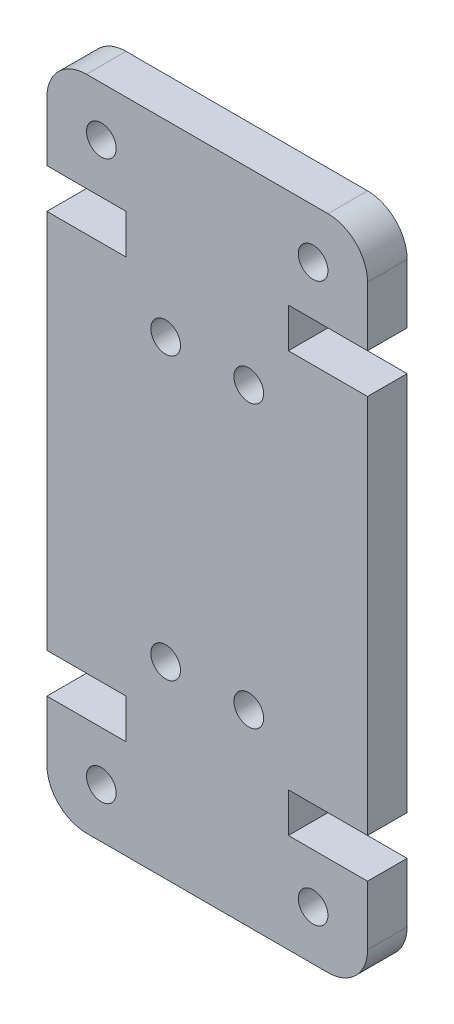
ISO-10303-21;
HEADER;
FILE_DESCRIPTION(('STEP AP214'),'2;1');
FILE_NAME('part.step','',(''),(''),'','','');
FILE_SCHEMA(('AUTOMOTIVE_DESIGN { 1 0 10303 214 1 1 1 1 }'));
ENDSEC;
DATA;
#1=APPLICATION_CONTEXT('core data for automotive mechanical design processes');
#2=APPLICATION_PROTOCOL_DEFINITION('international standard','automotive_design',2000,#1);
#3=PRODUCT_CONTEXT('',#1,'mechanical');
#4=PRODUCT('Part','Part','',(#3));
#5=PRODUCT_RELATED_PRODUCT_CATEGORY('part','',(#4));
#6=PRODUCT_DEFINITION_FORMATION('','',#4);
#7=PRODUCT_DEFINITION_CONTEXT('part definition',#1,'design');
#8=PRODUCT_DEFINITION('design','',#6,#7);
#9=PRODUCT_DEFINITION_SHAPE('','',#8);
#10=(LENGTH_UNIT() NAMED_UNIT(*) SI_UNIT(.MILLI.,.METRE.));
#11=(NAMED_UNIT(*) PLANE_ANGLE_UNIT() SI_UNIT($,.RADIAN.));
#12=(NAMED_UNIT(*) SI_UNIT($,.STERADIAN.) SOLID_ANGLE_UNIT());
#13=UNCERTAINTY_MEASURE_WITH_UNIT(LENGTH_MEASURE(1.E-05),#10,'distance_accuracy_value','');
#14=(GEOMETRIC_REPRESENTATION_CONTEXT(3) GLOBAL_UNCERTAINTY_ASSIGNED_CONTEXT((#13)) GLOBAL_UNIT_ASSIGNED_CONTEXT((#10,
#11,#12)) REPRESENTATION_CONTEXT('',''));
#15=CARTESIAN_POINT('',(0.,0.,0.));
#16=DIRECTION('',(0.,0.,1.));
#17=DIRECTION('',(1.,0.,0.));
#18=AXIS2_PLACEMENT_3D('',#15,#16,#17);
#19=CARTESIAN_POINT('',(2.00000000000001,2.,4.));
#20=DIRECTION('',(0.,0.,1.));
#21=DIRECTION('',(1.,0.,0.));
#22=AXIS2_PLACEMENT_3D('',#19,#20,#21);
#23=PLANE('',#22);
#24=CARTESIAN_POINT('',(10.2,23.7100000000004,4.));
#25=DIRECTION('',(0.,0.,1.));
#26=DIRECTION('',(1.,0.,0.));
#27=AXIS2_PLACEMENT_3D('',#24,#25,#26);
#28=CIRCLE('',#27,0.749999999999999);
#29=CARTESIAN_POINT('',(10.95,23.7100000000004,4.));
#30=VERTEX_POINT('',#29);
#31=EDGE_CURVE('E299',#30,#30,#28,.T.);
#32=ORIENTED_EDGE('',*,*,#31,.F.);
#33=EDGE_LOOP('',(#32));
#34=FACE_BOUND('',#33,.T.);
#35=CARTESIAN_POINT('',(6.,9.49999999999962,4.));
#36=DIRECTION('',(0.,0.,1.));
#37=DIRECTION('',(1.,0.,0.));
#38=AXIS2_PLACEMENT_3D('',#35,#36,#37);
#39=CIRCLE('',#38,0.75);
#40=CARTESIAN_POINT('',(6.75,9.49999999999962,4.));
#41=VERTEX_POINT('',#40);
#42=EDGE_CURVE('E305',#41,#41,#39,.T.);
#43=ORIENTED_EDGE('',*,*,#42,.F.);
#44=EDGE_LOOP('',(#43));
#45=FACE_BOUND('',#44,.T.);
#46=CARTESIAN_POINT('',(2.75000000000003,30.7099999999998,4.));
#47=DIRECTION('',(0.,0.,1.));
#48=DIRECTION('',(-1.,0.,0.));
#49=AXIS2_PLACEMENT_3D('',#46,#47,#48);
#50=CIRCLE('',#49,0.75);
#51=CARTESIAN_POINT('',(2.00000000000003,30.7099999999998,4.));
#52=VERTEX_POINT('',#51);
#53=EDGE_CURVE('E311',#52,#52,#50,.T.);
#54=ORIENTED_EDGE('',*,*,#53,.F.);
#55=EDGE_LOOP('',(#54));
#56=FACE_BOUND('',#55,.T.);
#57=CARTESIAN_POINT('',(13.45,2.50000000000017,4.));
#58=DIRECTION('',(0.,0.,1.));
#59=DIRECTION('',(-1.,0.,0.));
#60=AXIS2_PLACEMENT_3D('',#57,#58,#59);
#61=CIRCLE('',#60,0.750000000000009);
#62=CARTESIAN_POINT('',(12.7,2.50000000000017,4.));
#63=VERTEX_POINT('',#62);
#64=EDGE_CURVE('E317',#63,#63,#61,.T.);
#65=ORIENTED_EDGE('',*,*,#64,.F.);
#66=EDGE_LOOP('',(#65));
#67=FACE_BOUND('',#66,.T.);
#68=DIRECTION('',(1.,0.,0.));
#69=VECTOR('',#68,1.);
#70=CARTESIAN_POINT('',(0.,6.99999999999946,4.));
#71=LINE('',#70,#69);
#72=CARTESIAN_POINT('',(0.,6.99999999999946,4.));
#73=VERTEX_POINT('',#72);
#74=CARTESIAN_POINT('',(4.00000000000001,6.99999999999946,4.));
#75=VERTEX_POINT('',#74);
#76=EDGE_CURVE('E320',#73,#75,#71,.T.);
#77=ORIENTED_EDGE('',*,*,#76,.T.);
#78=DIRECTION('',(0.,-1.,0.));
#79=VECTOR('',#78,1.);
#80=CARTESIAN_POINT('',(4.00000000000001,6.99999999999946,4.));
#81=LINE('',#80,#79);
#82=CARTESIAN_POINT('',(4.,4.99999999999945,4.));
#83=VERTEX_POINT('',#82);
#84=EDGE_CURVE('E287',#75,#83,#81,.T.);
#85=ORIENTED_EDGE('',*,*,#84,.T.);
#86=DIRECTION('',(-1.,0.,0.));
#87=VECTOR('',#86,1.);
#88=CARTESIAN_POINT('',(4.,4.99999999999945,4.));
#89=LINE('',#88,#87);
#90=CARTESIAN_POINT('',(0.,4.99999999999945,4.));
#91=VERTEX_POINT('',#90);
#92=EDGE_CURVE('E283',#83,#91,#89,.T.);
#93=ORIENTED_EDGE('',*,*,#92,.T.);
#94=DIRECTION('',(0.,-1.,0.));
#95=VECTOR('',#94,1.);
#96=CARTESIAN_POINT('',(0.,2.,4.));
#97=LINE('',#96,#95);
#98=CARTESIAN_POINT('',(0.,2.,4.));
#99=VERTEX_POINT('',#98);
#100=EDGE_CURVE('E324',#91,#99,#97,.T.);
#101=ORIENTED_EDGE('',*,*,#100,.T.);
#102=CARTESIAN_POINT('',(2.00000000000001,2.,4.));
#103=DIRECTION('',(0.,0.,1.));
#104=DIRECTION('',(1.,0.,0.));
#105=AXIS2_PLACEMENT_3D('',#102,#103,#104);
#106=CIRCLE('',#105,2.00000000000001);
#107=CARTESIAN_POINT('',(2.00000000000001,0.,4.));
#108=VERTEX_POINT('',#107);
#109=EDGE_CURVE('E326',#99,#108,#106,.T.);
#110=ORIENTED_EDGE('',*,*,#109,.T.);
#111=DIRECTION('',(1.,0.,0.));
#112=VECTOR('',#111,1.);
#113=CARTESIAN_POINT('',(2.00000000000001,0.,4.));
#114=LINE('',#113,#112);
#115=CARTESIAN_POINT('',(14.2,0.,4.));
#116=VERTEX_POINT('',#115);
#117=EDGE_CURVE('E328',#108,#116,#114,.T.);
#118=ORIENTED_EDGE('',*,*,#117,.T.);
#119=CARTESIAN_POINT('',(14.2,2.,4.));
#120=DIRECTION('',(0.,0.,1.));
#121=DIRECTION('',(-1.,0.,0.));
#122=AXIS2_PLACEMENT_3D('',#119,#120,#121);
#123=CIRCLE('',#122,2.);
#124=CARTESIAN_POINT('',(16.2,2.,4.));
#125=VERTEX_POINT('',#124);
#126=EDGE_CURVE('E330',#116,#125,#123,.T.);
#127=ORIENTED_EDGE('',*,*,#126,.T.);
#128=DIRECTION('',(0.,1.,0.));
#129=VECTOR('',#128,1.);
#130=CARTESIAN_POINT('',(16.2,2.,4.));
#131=LINE('',#130,#129);
#132=CARTESIAN_POINT('',(16.2,4.99999999999945,4.));
#133=VERTEX_POINT('',#132);
#134=EDGE_CURVE('E332',#125,#133,#131,.T.);
#135=ORIENTED_EDGE('',*,*,#134,.T.);
#136=DIRECTION('',(-1.,0.,0.));
#137=VECTOR('',#136,1.);
#138=CARTESIAN_POINT('',(12.2,4.99999999999945,4.));
#139=LINE('',#138,#137);
#140=CARTESIAN_POINT('',(12.2,4.99999999999945,4.));
#141=VERTEX_POINT('',#140);
#142=EDGE_CURVE('E334',#133,#141,#139,.T.);
#143=ORIENTED_EDGE('',*,*,#142,.T.);
#144=DIRECTION('',(0.,1.,0.));
#145=VECTOR('',#144,1.);
#146=CARTESIAN_POINT('',(12.2,6.99999999999945,4.));
#147=LINE('',#146,#145);
#148=CARTESIAN_POINT('',(12.2,6.99999999999945,4.));
#149=VERTEX_POINT('',#148);
#150=EDGE_CURVE('E336',#141,#149,#147,.T.);
#151=ORIENTED_EDGE('',*,*,#150,.T.);
#152=DIRECTION('',(1.,0.,0.));
#153=VECTOR('',#152,1.);
#154=CARTESIAN_POINT('',(16.2,6.99999999999945,4.));
#155=LINE('',#154,#153);
#156=CARTESIAN_POINT('',(16.2,6.99999999999945,4.));
#157=VERTEX_POINT('',#156);
#158=EDGE_CURVE('E338',#149,#157,#155,.T.);
#159=ORIENTED_EDGE('',*,*,#158,.T.);
#160=DIRECTION('',(0.,1.,0.));
#161=VECTOR('',#160,1.);
#162=CARTESIAN_POINT('',(16.2,26.2100000000006,4.));
#163=LINE('',#162,#161);
#164=CARTESIAN_POINT('',(16.2,26.2100000000006,4.));
#165=VERTEX_POINT('',#164);
#166=EDGE_CURVE('E340',#157,#165,#163,.T.);
#167=ORIENTED_EDGE('',*,*,#166,.T.);
#168=DIRECTION('',(-1.,0.,0.));
#169=VECTOR('',#168,1.);
#170=CARTESIAN_POINT('',(16.2,26.2100000000006,4.));
#171=LINE('',#170,#169);
#172=CARTESIAN_POINT('',(12.2,26.2100000000006,4.));
#173=VERTEX_POINT('',#172);
#174=EDGE_CURVE('E342',#165,#173,#171,.T.);
#175=ORIENTED_EDGE('',*,*,#174,.T.);
#176=DIRECTION('',(0.,1.,0.));
#177=VECTOR('',#176,1.);
#178=CARTESIAN_POINT('',(12.2,26.2100000000006,4.));
#179=LINE('',#178,#177);
#180=CARTESIAN_POINT('',(12.2,28.2100000000006,4.));
#181=VERTEX_POINT('',#180);
#182=EDGE_CURVE('E344',#173,#181,#179,.T.);
#183=ORIENTED_EDGE('',*,*,#182,.T.);
#184=DIRECTION('',(1.,0.,0.));
#185=VECTOR('',#184,1.);
#186=CARTESIAN_POINT('',(12.2,28.2100000000006,4.));
#187=LINE('',#186,#185);
#188=CARTESIAN_POINT('',(16.2,28.2100000000006,4.));
#189=VERTEX_POINT('',#188);
#190=EDGE_CURVE('E346',#181,#189,#187,.T.);
#191=ORIENTED_EDGE('',*,*,#190,.T.);
#192=DIRECTION('',(0.,1.,0.));
#193=VECTOR('',#192,1.);
#194=CARTESIAN_POINT('',(16.2,31.21,4.));
#195=LINE('',#194,#193);
#196=CARTESIAN_POINT('',(16.2,31.21,4.));
#197=VERTEX_POINT('',#196);
#198=EDGE_CURVE('E348',#189,#197,#195,.T.);
#199=ORIENTED_EDGE('',*,*,#198,.T.);
#200=CARTESIAN_POINT('',(14.2,31.21,4.));
#201=DIRECTION('',(0.,0.,1.));
#202=DIRECTION('',(1.,0.,0.));
#203=AXIS2_PLACEMENT_3D('',#200,#201,#202);
#204=CIRCLE('',#203,2.);
#205=CARTESIAN_POINT('',(14.2,33.21,4.));
#206=VERTEX_POINT('',#205);
#207=EDGE_CURVE('E350',#197,#206,#204,.T.);
#208=ORIENTED_EDGE('',*,*,#207,.T.);
#209=DIRECTION('',(-1.,0.,0.));
#210=VECTOR('',#209,1.);
#211=CARTESIAN_POINT('',(1.99999999999999,33.21,4.));
#212=LINE('',#211,#210);
#213=CARTESIAN_POINT('',(1.99999999999999,33.21,4.));
#214=VERTEX_POINT('',#213);
#215=EDGE_CURVE('E352',#206,#214,#212,.T.);
#216=ORIENTED_EDGE('',*,*,#215,.T.);
#217=CARTESIAN_POINT('',(1.99999999999999,31.21,4.));
#218=DIRECTION('',(0.,0.,1.));
#219=DIRECTION('',(-1.,0.,0.));
#220=AXIS2_PLACEMENT_3D('',#217,#218,#219);
#221=CIRCLE('',#220,2.);
#222=CARTESIAN_POINT('',(0.,31.21,4.));
#223=VERTEX_POINT('',#222);
#224=EDGE_CURVE('E354',#214,#223,#221,.T.);
#225=ORIENTED_EDGE('',*,*,#224,.T.);
#226=DIRECTION('',(0.,-1.,0.));
#227=VECTOR('',#226,1.);
#228=CARTESIAN_POINT('',(0.,31.21,4.));
#229=LINE('',#228,#227);
#230=CARTESIAN_POINT('',(0.,28.2100000000006,4.));
#231=VERTEX_POINT('',#230);
#232=EDGE_CURVE('E222',#223,#231,#229,.T.);
#233=ORIENTED_EDGE('',*,*,#232,.T.);
#234=DIRECTION('',(1.,0.,0.));
#235=VECTOR('',#234,1.);
#236=CARTESIAN_POINT('',(3.99999999999999,28.2100000000006,4.));
#237=LINE('',#236,#235);
#238=CARTESIAN_POINT('',(3.99999999999999,28.2100000000006,4.));
#239=VERTEX_POINT('',#238);
#240=EDGE_CURVE('E357',#231,#239,#237,.T.);
#241=ORIENTED_EDGE('',*,*,#240,.T.);
#242=DIRECTION('',(0.,-1.,0.));
#243=VECTOR('',#242,1.);
#244=CARTESIAN_POINT('',(3.99999999999999,26.2100000000006,4.));
#245=LINE('',#244,#243);
#246=CARTESIAN_POINT('',(3.99999999999999,26.2100000000006,4.));
#247=VERTEX_POINT('',#246);
#248=EDGE_CURVE('E359',#239,#247,#245,.T.);
#249=ORIENTED_EDGE('',*,*,#248,.T.);
#250=DIRECTION('',(-1.,0.,0.));
#251=VECTOR('',#250,1.);
#252=CARTESIAN_POINT('',(0.,26.2100000000005,4.));
#253=LINE('',#252,#251);
#254=CARTESIAN_POINT('',(0.,26.2100000000005,4.));
#255=VERTEX_POINT('',#254);
#256=EDGE_CURVE('E361',#247,#255,#253,.T.);
#257=ORIENTED_EDGE('',*,*,#256,.T.);
#258=DIRECTION('',(0.,-1.,0.));
#259=VECTOR('',#258,1.);
#260=CARTESIAN_POINT('',(0.,26.2100000000005,4.));
#261=LINE('',#260,#259);
#262=EDGE_CURVE('E58',#255,#73,#261,.T.);
#263=ORIENTED_EDGE('',*,*,#262,.T.);
#264=EDGE_LOOP('',(#77,#85,#93,#101,#110,#118,#127,#135,#143,#151,#159,#167,#175,#183,#191,#199,
#208,#216,#225,#233,#241,#249,#257,#263));
#265=FACE_BOUND('',#264,.T.);
#266=CARTESIAN_POINT('',(10.2,9.49999999999962,4.));
#267=DIRECTION('',(0.,0.,1.));
#268=DIRECTION('',(-1.,0.,0.));
#269=AXIS2_PLACEMENT_3D('',#266,#267,#268);
#270=CIRCLE('',#269,0.750000000000002);
#271=CARTESIAN_POINT('',(9.45,9.49999999999962,4.));
#272=VERTEX_POINT('',#271);
#273=EDGE_CURVE('E314',#272,#272,#270,.T.);
#274=ORIENTED_EDGE('',*,*,#273,.F.);
#275=EDGE_LOOP('',(#274));
#276=FACE_BOUND('',#275,.T.);
#277=CARTESIAN_POINT('',(5.99999999999999,23.7100000000004,4.));
#278=DIRECTION('',(0.,0.,1.));
#279=DIRECTION('',(-1.,0.,0.));
#280=AXIS2_PLACEMENT_3D('',#277,#278,#279);
#281=CIRCLE('',#280,0.750000000000001);
#282=CARTESIAN_POINT('',(5.24999999999999,23.7100000000004,4.));
#283=VERTEX_POINT('',#282);
#284=EDGE_CURVE('E308',#283,#283,#281,.T.);
#285=ORIENTED_EDGE('',*,*,#284,.F.);
#286=EDGE_LOOP('',(#285));
#287=FACE_BOUND('',#286,.T.);
#288=CARTESIAN_POINT('',(2.75000000000004,2.50000000000017,4.));
#289=DIRECTION('',(0.,0.,1.));
#290=DIRECTION('',(1.,0.,0.));
#291=AXIS2_PLACEMENT_3D('',#288,#289,#290);
#292=CIRCLE('',#291,0.75);
#293=CARTESIAN_POINT('',(3.50000000000004,2.50000000000017,4.));
#294=VERTEX_POINT('',#293);
#295=EDGE_CURVE('E302',#294,#294,#292,.T.);
#296=ORIENTED_EDGE('',*,*,#295,.F.);
#297=EDGE_LOOP('',(#296));
#298=FACE_BOUND('',#297,.T.);
#299=CARTESIAN_POINT('',(13.45,30.7099999999998,4.));
#300=DIRECTION('',(0.,0.,1.));
#301=DIRECTION('',(1.,0.,0.));
#302=AXIS2_PLACEMENT_3D('',#299,#300,#301);
#303=CIRCLE('',#302,0.75000000000001);
#304=CARTESIAN_POINT('',(14.2,30.7099999999998,4.));
#305=VERTEX_POINT('',#304);
#306=EDGE_CURVE('E291',#305,#305,#303,.T.);
#307=ORIENTED_EDGE('',*,*,#306,.F.);
#308=EDGE_LOOP('',(#307));
#309=FACE_BOUND('',#308,.T.);
#310=ADVANCED_FACE('F34',(#34,#45,#56,#67,#265,#276,#287,#298,#309),#23,.T.);
#311=CARTESIAN_POINT('',(0.,6.99999999999946,4.));
#312=DIRECTION('',(0.,1.,0.));
#313=DIRECTION('',(0.,0.,1.));
#314=AXIS2_PLACEMENT_3D('',#311,#312,#313);
#315=PLANE('',#314);
#316=DIRECTION('',(0.,0.,-1.));
#317=VECTOR('',#316,1.);
#318=CARTESIAN_POINT('',(0.,6.99999999999946,4.));
#319=LINE('',#318,#317);
#320=CARTESIAN_POINT('',(0.,6.99999999999946,2.));
#321=VERTEX_POINT('',#320);
#322=EDGE_CURVE('E364',#73,#321,#319,.T.);
#323=ORIENTED_EDGE('',*,*,#322,.T.);
#324=DIRECTION('',(1.,0.,0.));
#325=VECTOR('',#324,1.);
#326=CARTESIAN_POINT('',(0.,6.99999999999946,2.));
#327=LINE('',#326,#325);
#328=CARTESIAN_POINT('',(4.00000000000001,6.99999999999946,2.));
#329=VERTEX_POINT('',#328);
#330=EDGE_CURVE('E50',#321,#329,#327,.T.);
#331=ORIENTED_EDGE('',*,*,#330,.T.);
#332=DIRECTION('',(0.,0.,-1.));
#333=VECTOR('',#332,1.);
#334=CARTESIAN_POINT('',(4.00000000000001,6.99999999999946,4.));
#335=LINE('',#334,#333);
#336=EDGE_CURVE('E11',#75,#329,#335,.T.);
#337=ORIENTED_EDGE('',*,*,#336,.F.);
#338=ORIENTED_EDGE('',*,*,#76,.F.);
#339=EDGE_LOOP('',(#323,#331,#337,#338));
#340=FACE_BOUND('',#339,.T.);
#341=ADVANCED_FACE('F36',(#340),#315,.F.);
#342=CARTESIAN_POINT('',(4.00000000000001,6.99999999999946,4.));
#343=DIRECTION('',(1.,0.,0.));
#344=DIRECTION('',(0.,1.,0.));
#345=AXIS2_PLACEMENT_3D('',#342,#343,#344);
#346=PLANE('',#345);
#347=ORIENTED_EDGE('',*,*,#336,.T.);
#348=DIRECTION('',(0.,-1.,0.));
#349=VECTOR('',#348,1.);
#350=CARTESIAN_POINT('',(4.00000000000001,6.99999999999946,2.));
#351=LINE('',#350,#349);
#352=CARTESIAN_POINT('',(4.,4.99999999999945,2.));
#353=VERTEX_POINT('',#352);
#354=EDGE_CURVE('E288',#329,#353,#351,.T.);
#355=ORIENTED_EDGE('',*,*,#354,.T.);
#356=DIRECTION('',(0.,0.,-1.));
#357=VECTOR('',#356,1.);
#358=CARTESIAN_POINT('',(4.,4.99999999999945,4.));
#359=LINE('',#358,#357);
#360=EDGE_CURVE('E43',#83,#353,#359,.T.);
#361=ORIENTED_EDGE('',*,*,#360,.F.);
#362=ORIENTED_EDGE('',*,*,#84,.F.);
#363=EDGE_LOOP('',(#347,#355,#361,#362));
#364=FACE_BOUND('',#363,.T.);
#365=ADVANCED_FACE('F286',(#364),#346,.F.);
#366=CARTESIAN_POINT('',(4.,4.99999999999945,4.));
#367=DIRECTION('',(0.,-1.,0.));
#368=DIRECTION('',(0.,0.,-1.));
#369=AXIS2_PLACEMENT_3D('',#366,#367,#368);
#370=PLANE('',#369);
#371=ORIENTED_EDGE('',*,*,#360,.T.);
#372=DIRECTION('',(-1.,0.,0.));
#373=VECTOR('',#372,1.);
#374=CARTESIAN_POINT('',(4.,4.99999999999945,2.));
#375=LINE('',#374,#373);
#376=CARTESIAN_POINT('',(0.,4.99999999999945,2.));
#377=VERTEX_POINT('',#376);
#378=EDGE_CURVE('E282',#353,#377,#375,.T.);
#379=ORIENTED_EDGE('',*,*,#378,.T.);
#380=DIRECTION('',(0.,0.,-1.));
#381=VECTOR('',#380,1.);
#382=CARTESIAN_POINT('',(0.,4.99999999999945,4.));
#383=LINE('',#382,#381);
#384=EDGE_CURVE('E272',#91,#377,#383,.T.);
#385=ORIENTED_EDGE('',*,*,#384,.F.);
#386=ORIENTED_EDGE('',*,*,#92,.F.);
#387=EDGE_LOOP('',(#371,#379,#385,#386));
#388=FACE_BOUND('',#387,.T.);
#389=ADVANCED_FACE('F280',(#388),#370,.F.);
#390=CARTESIAN_POINT('',(0.,2.,4.));
#391=DIRECTION('',(1.,0.,0.));
#392=DIRECTION('',(0.,0.,-1.));
#393=AXIS2_PLACEMENT_3D('',#390,#391,#392);
#394=PLANE('',#393);
#395=ORIENTED_EDGE('',*,*,#384,.T.);
#396=DIRECTION('',(0.,-1.,0.));
#397=VECTOR('',#396,1.);
#398=CARTESIAN_POINT('',(0.,33.21,2.));
#399=LINE('',#398,#397);
#400=CARTESIAN_POINT('',(0.,2.,2.));
#401=VERTEX_POINT('',#400);
#402=EDGE_CURVE('E209',#377,#401,#399,.T.);
#403=ORIENTED_EDGE('',*,*,#402,.T.);
#404=DIRECTION('',(0.,0.,-1.));
#405=VECTOR('',#404,1.);
#406=CARTESIAN_POINT('',(0.,2.,4.));
#407=LINE('',#406,#405);
#408=EDGE_CURVE('E269',#99,#401,#407,.T.);
#409=ORIENTED_EDGE('',*,*,#408,.F.);
#410=ORIENTED_EDGE('',*,*,#100,.F.);
#411=EDGE_LOOP('',(#395,#403,#409,#410));
#412=FACE_BOUND('',#411,.T.);
#413=ADVANCED_FACE('F427',(#412),#394,.F.);
#414=CARTESIAN_POINT('',(2.00000000000001,2.,4.));
#415=DIRECTION('',(0.,0.,-1.));
#416=DIRECTION('',(-1.,0.,0.));
#417=AXIS2_PLACEMENT_3D('',#414,#415,#416);
#418=CYLINDRICAL_SURFACE('',#417,2.00000000000001);
#419=ORIENTED_EDGE('',*,*,#408,.T.);
#420=CARTESIAN_POINT('',(2.00000000000001,2.,2.));
#421=DIRECTION('',(0.,0.,1.));
#422=DIRECTION('',(1.,0.,0.));
#423=AXIS2_PLACEMENT_3D('',#420,#421,#422);
#424=CIRCLE('',#423,2.00000000000001);
#425=CARTESIAN_POINT('',(2.00000000000001,0.,2.));
#426=VERTEX_POINT('',#425);
#427=EDGE_CURVE('E293',#401,#426,#424,.T.);
#428=ORIENTED_EDGE('',*,*,#427,.T.);
#429=DIRECTION('',(0.,0.,-1.));
#430=VECTOR('',#429,1.);
#431=CARTESIAN_POINT('',(2.00000000000001,0.,4.));
#432=LINE('',#431,#430);
#433=EDGE_CURVE('E266',#108,#426,#432,.T.);
#434=ORIENTED_EDGE('',*,*,#433,.F.);
#435=ORIENTED_EDGE('',*,*,#109,.F.);
#436=EDGE_LOOP('',(#419,#428,#434,#435));
#437=FACE_BOUND('',#436,.T.);
#438=ADVANCED_FACE('F413',(#437),#418,.T.);
#439=CARTESIAN_POINT('',(2.00000000000001,0.,4.));
#440=DIRECTION('',(0.,1.,0.));
#441=DIRECTION('',(-1.,0.,0.));
#442=AXIS2_PLACEMENT_3D('',#439,#440,#441);
#443=PLANE('',#442);
#444=ORIENTED_EDGE('',*,*,#433,.T.);
#445=DIRECTION('',(1.,0.,0.));
#446=VECTOR('',#445,1.);
#447=CARTESIAN_POINT('',(0.,0.,2.));
#448=LINE('',#447,#446);
#449=CARTESIAN_POINT('',(14.2,0.,2.));
#450=VERTEX_POINT('',#449);
#451=EDGE_CURVE('E206',#426,#450,#448,.T.);
#452=ORIENTED_EDGE('',*,*,#451,.T.);
#453=DIRECTION('',(0.,0.,-1.));
#454=VECTOR('',#453,1.);
#455=CARTESIAN_POINT('',(14.2,0.,4.));
#456=LINE('',#455,#454);
#457=EDGE_CURVE('E263',#116,#450,#456,.T.);
#458=ORIENTED_EDGE('',*,*,#457,.F.);
#459=ORIENTED_EDGE('',*,*,#117,.F.);
#460=EDGE_LOOP('',(#444,#452,#458,#459));
#461=FACE_BOUND('',#460,.T.);
#462=ADVANCED_FACE('F420',(#461),#443,.F.);
#463=CARTESIAN_POINT('',(14.2,2.,4.));
#464=DIRECTION('',(0.,0.,-1.));
#465=DIRECTION('',(-1.,0.,0.));
#466=AXIS2_PLACEMENT_3D('',#463,#464,#465);
#467=CYLINDRICAL_SURFACE('',#466,2.);
#468=ORIENTED_EDGE('',*,*,#457,.T.);
#469=CARTESIAN_POINT('',(14.2,2.,2.));
#470=DIRECTION('',(0.,0.,1.));
#471=DIRECTION('',(1.,0.,0.));
#472=AXIS2_PLACEMENT_3D('',#469,#470,#471);
#473=CIRCLE('',#472,2.);
#474=CARTESIAN_POINT('',(16.2,2.,2.));
#475=VERTEX_POINT('',#474);
#476=EDGE_CURVE('E408',#450,#475,#473,.T.);
#477=ORIENTED_EDGE('',*,*,#476,.T.);
#478=DIRECTION('',(0.,0.,-1.));
#479=VECTOR('',#478,1.);
#480=CARTESIAN_POINT('',(16.2,2.,4.));
#481=LINE('',#480,#479);
#482=EDGE_CURVE('E260',#125,#475,#481,.T.);
#483=ORIENTED_EDGE('',*,*,#482,.F.);
#484=ORIENTED_EDGE('',*,*,#126,.F.);
#485=EDGE_LOOP('',(#468,#477,#483,#484));
#486=FACE_BOUND('',#485,.T.);
#487=ADVANCED_FACE('F536',(#486),#467,.T.);
#488=CARTESIAN_POINT('',(16.2,2.,4.));
#489=DIRECTION('',(-1.,0.,0.));
#490=DIRECTION('',(0.,0.,1.));
#491=AXIS2_PLACEMENT_3D('',#488,#489,#490);
#492=PLANE('',#491);
#493=ORIENTED_EDGE('',*,*,#482,.T.);
#494=DIRECTION('',(0.,1.,0.));
#495=VECTOR('',#494,1.);
#496=CARTESIAN_POINT('',(16.2,0.,2.));
#497=LINE('',#496,#495);
#498=CARTESIAN_POINT('',(16.2,4.99999999999945,2.));
#499=VERTEX_POINT('',#498);
#500=EDGE_CURVE('E434',#475,#499,#497,.T.);
#501=ORIENTED_EDGE('',*,*,#500,.T.);
#502=DIRECTION('',(0.,0.,-1.));
#503=VECTOR('',#502,1.);
#504=CARTESIAN_POINT('',(16.2,4.99999999999945,4.));
#505=LINE('',#504,#503);
#506=EDGE_CURVE('E257',#133,#499,#505,.T.);
#507=ORIENTED_EDGE('',*,*,#506,.F.);
#508=ORIENTED_EDGE('',*,*,#134,.F.);
#509=EDGE_LOOP('',(#493,#501,#507,#508));
#510=FACE_BOUND('',#509,.T.);
#511=ADVANCED_FACE('F532',(#510),#492,.F.);
#512=CARTESIAN_POINT('',(12.2,4.99999999999945,4.));
#513=DIRECTION('',(0.,-1.,0.));
#514=DIRECTION('',(0.,0.,-1.));
#515=AXIS2_PLACEMENT_3D('',#512,#513,#514);
#516=PLANE('',#515);
#517=ORIENTED_EDGE('',*,*,#506,.T.);
#518=DIRECTION('',(-1.,0.,0.));
#519=VECTOR('',#518,1.);
#520=CARTESIAN_POINT('',(12.2,4.99999999999945,2.));
#521=LINE('',#520,#519);
#522=CARTESIAN_POINT('',(12.2,4.99999999999945,2.));
#523=VERTEX_POINT('',#522);
#524=EDGE_CURVE('E405',#499,#523,#521,.T.);
#525=ORIENTED_EDGE('',*,*,#524,.T.);
#526=DIRECTION('',(0.,0.,-1.));
#527=VECTOR('',#526,1.);
#528=CARTESIAN_POINT('',(12.2,4.99999999999945,4.));
#529=LINE('',#528,#527);
#530=EDGE_CURVE('E254',#141,#523,#529,.T.);
#531=ORIENTED_EDGE('',*,*,#530,.F.);
#532=ORIENTED_EDGE('',*,*,#142,.F.);
#533=EDGE_LOOP('',(#517,#525,#531,#532));
#534=FACE_BOUND('',#533,.T.);
#535=ADVANCED_FACE('F528',(#534),#516,.F.);
#536=CARTESIAN_POINT('',(12.2,6.99999999999945,4.));
#537=DIRECTION('',(-1.,0.,0.));
#538=DIRECTION('',(0.,0.,1.));
#539=AXIS2_PLACEMENT_3D('',#536,#537,#538);
#540=PLANE('',#539);
#541=ORIENTED_EDGE('',*,*,#530,.T.);
#542=DIRECTION('',(0.,1.,0.));
#543=VECTOR('',#542,1.);
#544=CARTESIAN_POINT('',(12.2,6.99999999999945,2.));
#545=LINE('',#544,#543);
#546=CARTESIAN_POINT('',(12.2,6.99999999999945,2.));
#547=VERTEX_POINT('',#546);
#548=EDGE_CURVE('E402',#523,#547,#545,.T.);
#549=ORIENTED_EDGE('',*,*,#548,.T.);
#550=DIRECTION('',(0.,0.,-1.));
#551=VECTOR('',#550,1.);
#552=CARTESIAN_POINT('',(12.2,6.99999999999945,4.));
#553=LINE('',#552,#551);
#554=EDGE_CURVE('E251',#149,#547,#553,.T.);
#555=ORIENTED_EDGE('',*,*,#554,.F.);
#556=ORIENTED_EDGE('',*,*,#150,.F.);
#557=EDGE_LOOP('',(#541,#549,#555,#556));
#558=FACE_BOUND('',#557,.T.);
#559=ADVANCED_FACE('F524',(#558),#540,.F.);
#560=CARTESIAN_POINT('',(16.2,6.99999999999945,4.));
#561=DIRECTION('',(0.,1.,0.));
#562=DIRECTION('',(-1.,0.,0.));
#563=AXIS2_PLACEMENT_3D('',#560,#561,#562);
#564=PLANE('',#563);
#565=ORIENTED_EDGE('',*,*,#554,.T.);
#566=DIRECTION('',(1.,0.,0.));
#567=VECTOR('',#566,1.);
#568=CARTESIAN_POINT('',(16.2,6.99999999999945,2.));
#569=LINE('',#568,#567);
#570=CARTESIAN_POINT('',(16.2,6.99999999999945,2.));
#571=VERTEX_POINT('',#570);
#572=EDGE_CURVE('E399',#547,#571,#569,.T.);
#573=ORIENTED_EDGE('',*,*,#572,.T.);
#574=DIRECTION('',(0.,0.,-1.));
#575=VECTOR('',#574,1.);
#576=CARTESIAN_POINT('',(16.2,6.99999999999945,4.));
#577=LINE('',#576,#575);
#578=EDGE_CURVE('E248',#157,#571,#577,.T.);
#579=ORIENTED_EDGE('',*,*,#578,.F.);
#580=ORIENTED_EDGE('',*,*,#158,.F.);
#581=EDGE_LOOP('',(#565,#573,#579,#580));
#582=FACE_BOUND('',#581,.T.);
#583=ADVANCED_FACE('F520',(#582),#564,.F.);
#584=CARTESIAN_POINT('',(16.2,26.2100000000006,4.));
#585=DIRECTION('',(-1.,0.,0.));
#586=DIRECTION('',(0.,0.,1.));
#587=AXIS2_PLACEMENT_3D('',#584,#585,#586);
#588=PLANE('',#587);
#589=ORIENTED_EDGE('',*,*,#578,.T.);
#590=CARTESIAN_POINT('',(16.2,26.2100000000006,2.));
#591=VERTEX_POINT('',#590);
#592=EDGE_CURVE('E433',#571,#591,#497,.T.);
#593=ORIENTED_EDGE('',*,*,#592,.T.);
#594=DIRECTION('',(0.,0.,-1.));
#595=VECTOR('',#594,1.);
#596=CARTESIAN_POINT('',(16.2,26.2100000000006,4.));
#597=LINE('',#596,#595);
#598=EDGE_CURVE('E245',#165,#591,#597,.T.);
#599=ORIENTED_EDGE('',*,*,#598,.F.);
#600=ORIENTED_EDGE('',*,*,#166,.F.);
#601=EDGE_LOOP('',(#589,#593,#599,#600));
#602=FACE_BOUND('',#601,.T.);
#603=ADVANCED_FACE('F516',(#602),#588,.F.);
#604=CARTESIAN_POINT('',(16.2,26.2100000000006,4.));
#605=DIRECTION('',(0.,-1.,0.));
#606=DIRECTION('',(0.,0.,-1.));
#607=AXIS2_PLACEMENT_3D('',#604,#605,#606);
#608=PLANE('',#607);
#609=ORIENTED_EDGE('',*,*,#598,.T.);
#610=DIRECTION('',(-1.,0.,0.));
#611=VECTOR('',#610,1.);
#612=CARTESIAN_POINT('',(16.2,26.2100000000006,2.));
#613=LINE('',#612,#611);
#614=CARTESIAN_POINT('',(12.2,26.2100000000006,2.));
#615=VERTEX_POINT('',#614);
#616=EDGE_CURVE('E396',#591,#615,#613,.T.);
#617=ORIENTED_EDGE('',*,*,#616,.T.);
#618=DIRECTION('',(0.,0.,-1.));
#619=VECTOR('',#618,1.);
#620=CARTESIAN_POINT('',(12.2,26.2100000000006,4.));
#621=LINE('',#620,#619);
#622=EDGE_CURVE('E242',#173,#615,#621,.T.);
#623=ORIENTED_EDGE('',*,*,#622,.F.);
#624=ORIENTED_EDGE('',*,*,#174,.F.);
#625=EDGE_LOOP('',(#609,#617,#623,#624));
#626=FACE_BOUND('',#625,.T.);
#627=ADVANCED_FACE('F512',(#626),#608,.F.);
#628=CARTESIAN_POINT('',(12.2,26.2100000000006,4.));
#629=DIRECTION('',(-1.,0.,0.));
#630=DIRECTION('',(0.,0.,1.));
#631=AXIS2_PLACEMENT_3D('',#628,#629,#630);
#632=PLANE('',#631);
#633=ORIENTED_EDGE('',*,*,#622,.T.);
#634=DIRECTION('',(0.,1.,0.));
#635=VECTOR('',#634,1.);
#636=CARTESIAN_POINT('',(12.2,26.2100000000006,2.));
#637=LINE('',#636,#635);
#638=CARTESIAN_POINT('',(12.2,28.2100000000006,2.));
#639=VERTEX_POINT('',#638);
#640=EDGE_CURVE('E393',#615,#639,#637,.T.);
#641=ORIENTED_EDGE('',*,*,#640,.T.);
#642=DIRECTION('',(0.,0.,-1.));
#643=VECTOR('',#642,1.);
#644=CARTESIAN_POINT('',(12.2,28.2100000000006,4.));
#645=LINE('',#644,#643);
#646=EDGE_CURVE('E239',#181,#639,#645,.T.);
#647=ORIENTED_EDGE('',*,*,#646,.F.);
#648=ORIENTED_EDGE('',*,*,#182,.F.);
#649=EDGE_LOOP('',(#633,#641,#647,#648));
#650=FACE_BOUND('',#649,.T.);
#651=ADVANCED_FACE('F508',(#650),#632,.F.);
#652=CARTESIAN_POINT('',(12.2,28.2100000000006,4.));
#653=DIRECTION('',(0.,1.,0.));
#654=DIRECTION('',(0.,0.,1.));
#655=AXIS2_PLACEMENT_3D('',#652,#653,#654);
#656=PLANE('',#655);
#657=ORIENTED_EDGE('',*,*,#646,.T.);
#658=DIRECTION('',(1.,0.,0.));
#659=VECTOR('',#658,1.);
#660=CARTESIAN_POINT('',(12.2,28.2100000000006,2.));
#661=LINE('',#660,#659);
#662=CARTESIAN_POINT('',(16.2,28.2100000000006,2.));
#663=VERTEX_POINT('',#662);
#664=EDGE_CURVE('E390',#639,#663,#661,.T.);
#665=ORIENTED_EDGE('',*,*,#664,.T.);
#666=DIRECTION('',(0.,0.,-1.));
#667=VECTOR('',#666,1.);
#668=CARTESIAN_POINT('',(16.2,28.2100000000006,4.));
#669=LINE('',#668,#667);
#670=EDGE_CURVE('E236',#189,#663,#669,.T.);
#671=ORIENTED_EDGE('',*,*,#670,.F.);
#672=ORIENTED_EDGE('',*,*,#190,.F.);
#673=EDGE_LOOP('',(#657,#665,#671,#672));
#674=FACE_BOUND('',#673,.T.);
#675=ADVANCED_FACE('F504',(#674),#656,.F.);
#676=CARTESIAN_POINT('',(16.2,31.21,4.));
#677=DIRECTION('',(-1.,0.,0.));
#678=DIRECTION('',(0.,0.,1.));
#679=AXIS2_PLACEMENT_3D('',#676,#677,#678);
#680=PLANE('',#679);
#681=ORIENTED_EDGE('',*,*,#670,.T.);
#682=CARTESIAN_POINT('',(16.2,31.21,2.));
#683=VERTEX_POINT('',#682);
#684=EDGE_CURVE('E430',#663,#683,#497,.T.);
#685=ORIENTED_EDGE('',*,*,#684,.T.);
#686=DIRECTION('',(0.,0.,-1.));
#687=VECTOR('',#686,1.);
#688=CARTESIAN_POINT('',(16.2,31.21,4.));
#689=LINE('',#688,#687);
#690=EDGE_CURVE('E233',#197,#683,#689,.T.);
#691=ORIENTED_EDGE('',*,*,#690,.F.);
#692=ORIENTED_EDGE('',*,*,#198,.F.);
#693=EDGE_LOOP('',(#681,#685,#691,#692));
#694=FACE_BOUND('',#693,.T.);
#695=ADVANCED_FACE('F500',(#694),#680,.F.);
#696=CARTESIAN_POINT('',(14.2,31.21,4.));
#697=DIRECTION('',(0.,0.,-1.));
#698=DIRECTION('',(-1.,0.,0.));
#699=AXIS2_PLACEMENT_3D('',#696,#697,#698);
#700=CYLINDRICAL_SURFACE('',#699,2.);
#701=ORIENTED_EDGE('',*,*,#690,.T.);
#702=CARTESIAN_POINT('',(14.2,31.21,2.));
#703=DIRECTION('',(0.,0.,1.));
#704=DIRECTION('',(1.,0.,0.));
#705=AXIS2_PLACEMENT_3D('',#702,#703,#704);
#706=CIRCLE('',#705,2.);
#707=CARTESIAN_POINT('',(14.2,33.21,2.));
#708=VERTEX_POINT('',#707);
#709=EDGE_CURVE('E219',#683,#708,#706,.T.);
#710=ORIENTED_EDGE('',*,*,#709,.T.);
#711=DIRECTION('',(0.,0.,-1.));
#712=VECTOR('',#711,1.);
#713=CARTESIAN_POINT('',(14.2,33.21,4.));
#714=LINE('',#713,#712);
#715=EDGE_CURVE('E225',#206,#708,#714,.T.);
#716=ORIENTED_EDGE('',*,*,#715,.F.);
#717=ORIENTED_EDGE('',*,*,#207,.F.);
#718=EDGE_LOOP('',(#701,#710,#716,#717));
#719=FACE_BOUND('',#718,.T.);
#720=ADVANCED_FACE('F496',(#719),#700,.T.);
#721=CARTESIAN_POINT('',(1.99999999999999,33.21,4.));
#722=DIRECTION('',(0.,-1.,0.));
#723=DIRECTION('',(0.,0.,-1.));
#724=AXIS2_PLACEMENT_3D('',#721,#722,#723);
#725=PLANE('',#724);
#726=ORIENTED_EDGE('',*,*,#715,.T.);
#727=DIRECTION('',(-1.,0.,0.));
#728=VECTOR('',#727,1.);
#729=CARTESIAN_POINT('',(16.2,33.21,2.));
#730=LINE('',#729,#728);
#731=CARTESIAN_POINT('',(1.99999999999999,33.21,2.));
#732=VERTEX_POINT('',#731);
#733=EDGE_CURVE('E435',#708,#732,#730,.T.);
#734=ORIENTED_EDGE('',*,*,#733,.T.);
#735=DIRECTION('',(0.,0.,-1.));
#736=VECTOR('',#735,1.);
#737=CARTESIAN_POINT('',(1.99999999999999,33.21,4.));
#738=LINE('',#737,#736);
#739=EDGE_CURVE('E218',#214,#732,#738,.T.);
#740=ORIENTED_EDGE('',*,*,#739,.F.);
#741=ORIENTED_EDGE('',*,*,#215,.F.);
#742=EDGE_LOOP('',(#726,#734,#740,#741));
#743=FACE_BOUND('',#742,.T.);
#744=ADVANCED_FACE('F493',(#743),#725,.F.);
#745=CARTESIAN_POINT('',(1.99999999999999,31.21,4.));
#746=DIRECTION('',(0.,0.,-1.));
#747=DIRECTION('',(-1.,0.,0.));
#748=AXIS2_PLACEMENT_3D('',#745,#746,#747);
#749=CYLINDRICAL_SURFACE('',#748,2.);
#750=ORIENTED_EDGE('',*,*,#739,.T.);
#751=CARTESIAN_POINT('',(1.99999999999999,31.21,2.));
#752=DIRECTION('',(0.,0.,1.));
#753=DIRECTION('',(1.,0.,0.));
#754=AXIS2_PLACEMENT_3D('',#751,#752,#753);
#755=CIRCLE('',#754,2.);
#756=CARTESIAN_POINT('',(0.,31.21,2.));
#757=VERTEX_POINT('',#756);
#758=EDGE_CURVE('E198',#732,#757,#755,.T.);
#759=ORIENTED_EDGE('',*,*,#758,.T.);
#760=DIRECTION('',(0.,0.,-1.));
#761=VECTOR('',#760,1.);
#762=CARTESIAN_POINT('',(0.,31.21,4.));
#763=LINE('',#762,#761);
#764=EDGE_CURVE('E215',#223,#757,#763,.T.);
#765=ORIENTED_EDGE('',*,*,#764,.F.);
#766=ORIENTED_EDGE('',*,*,#224,.F.);
#767=EDGE_LOOP('',(#750,#759,#765,#766));
#768=FACE_BOUND('',#767,.T.);
#769=ADVANCED_FACE('F213',(#768),#749,.T.);
#770=CARTESIAN_POINT('',(0.,31.21,4.));
#771=DIRECTION('',(1.,0.,0.));
#772=DIRECTION('',(0.,1.,0.));
#773=AXIS2_PLACEMENT_3D('',#770,#771,#772);
#774=PLANE('',#773);
#775=ORIENTED_EDGE('',*,*,#764,.T.);
#776=CARTESIAN_POINT('',(0.,28.2100000000006,2.));
#777=VERTEX_POINT('',#776);
#778=EDGE_CURVE('E195',#757,#777,#399,.T.);
#779=ORIENTED_EDGE('',*,*,#778,.T.);
#780=DIRECTION('',(0.,0.,-1.));
#781=VECTOR('',#780,1.);
#782=CARTESIAN_POINT('',(0.,28.2100000000006,4.));
#783=LINE('',#782,#781);
#784=EDGE_CURVE('E223',#231,#777,#783,.T.);
#785=ORIENTED_EDGE('',*,*,#784,.F.);
#786=ORIENTED_EDGE('',*,*,#232,.F.);
#787=EDGE_LOOP('',(#775,#779,#785,#786));
#788=FACE_BOUND('',#787,.T.);
#789=ADVANCED_FACE('F221',(#788),#774,.F.);
#790=CARTESIAN_POINT('',(3.99999999999999,28.2100000000006,4.));
#791=DIRECTION('',(0.,1.,0.));
#792=DIRECTION('',(-1.,0.,0.));
#793=AXIS2_PLACEMENT_3D('',#790,#791,#792);
#794=PLANE('',#793);
#795=ORIENTED_EDGE('',*,*,#784,.T.);
#796=DIRECTION('',(1.,0.,0.));
#797=VECTOR('',#796,1.);
#798=CARTESIAN_POINT('',(3.99999999999999,28.2100000000006,2.));
#799=LINE('',#798,#797);
#800=CARTESIAN_POINT('',(3.99999999999999,28.2100000000006,2.));
#801=VERTEX_POINT('',#800);
#802=EDGE_CURVE('E201',#777,#801,#799,.T.);
#803=ORIENTED_EDGE('',*,*,#802,.T.);
#804=DIRECTION('',(0.,0.,-1.));
#805=VECTOR('',#804,1.);
#806=CARTESIAN_POINT('',(3.99999999999999,28.2100000000006,4.));
#807=LINE('',#806,#805);
#808=EDGE_CURVE('E227',#239,#801,#807,.T.);
#809=ORIENTED_EDGE('',*,*,#808,.F.);
#810=ORIENTED_EDGE('',*,*,#240,.F.);
#811=EDGE_LOOP('',(#795,#803,#809,#810));
#812=FACE_BOUND('',#811,.T.);
#813=ADVANCED_FACE('F382',(#812),#794,.F.);
#814=CARTESIAN_POINT('',(3.99999999999999,26.2100000000006,4.));
#815=DIRECTION('',(1.,0.,0.));
#816=DIRECTION('',(0.,1.,0.));
#817=AXIS2_PLACEMENT_3D('',#814,#815,#816);
#818=PLANE('',#817);
#819=ORIENTED_EDGE('',*,*,#808,.T.);
#820=DIRECTION('',(0.,-1.,0.));
#821=VECTOR('',#820,1.);
#822=CARTESIAN_POINT('',(3.99999999999999,26.2100000000006,2.));
#823=LINE('',#822,#821);
#824=CARTESIAN_POINT('',(3.99999999999999,26.2100000000006,2.));
#825=VERTEX_POINT('',#824);
#826=EDGE_CURVE('E379',#801,#825,#823,.T.);
#827=ORIENTED_EDGE('',*,*,#826,.T.);
#828=DIRECTION('',(0.,0.,-1.));
#829=VECTOR('',#828,1.);
#830=CARTESIAN_POINT('',(3.99999999999999,26.2100000000006,4.));
#831=LINE('',#830,#829);
#832=EDGE_CURVE('E370',#247,#825,#831,.T.);
#833=ORIENTED_EDGE('',*,*,#832,.F.);
#834=ORIENTED_EDGE('',*,*,#248,.F.);
#835=EDGE_LOOP('',(#819,#827,#833,#834));
#836=FACE_BOUND('',#835,.T.);
#837=ADVANCED_FACE('F377',(#836),#818,.F.);
#838=CARTESIAN_POINT('',(0.,26.2100000000005,4.));
#839=DIRECTION('',(0.,-1.,0.));
#840=DIRECTION('',(1.,0.,0.));
#841=AXIS2_PLACEMENT_3D('',#838,#839,#840);
#842=PLANE('',#841);
#843=ORIENTED_EDGE('',*,*,#832,.T.);
#844=DIRECTION('',(-1.,0.,0.));
#845=VECTOR('',#844,1.);
#846=CARTESIAN_POINT('',(0.,26.2100000000005,2.));
#847=LINE('',#846,#845);
#848=CARTESIAN_POINT('',(0.,26.2100000000005,2.));
#849=VERTEX_POINT('',#848);
#850=EDGE_CURVE('E384',#825,#849,#847,.T.);
#851=ORIENTED_EDGE('',*,*,#850,.T.);
#852=DIRECTION('',(0.,0.,-1.));
#853=VECTOR('',#852,1.);
#854=CARTESIAN_POINT('',(0.,26.2100000000005,4.));
#855=LINE('',#854,#853);
#856=EDGE_CURVE('E367',#255,#849,#855,.T.);
#857=ORIENTED_EDGE('',*,*,#856,.F.);
#858=ORIENTED_EDGE('',*,*,#256,.F.);
#859=EDGE_LOOP('',(#843,#851,#857,#858));
#860=FACE_BOUND('',#859,.T.);
#861=ADVANCED_FACE('F460',(#860),#842,.F.);
#862=CARTESIAN_POINT('',(0.,26.2100000000005,4.));
#863=DIRECTION('',(1.,0.,0.));
#864=DIRECTION('',(0.,1.,0.));
#865=AXIS2_PLACEMENT_3D('',#862,#863,#864);
#866=PLANE('',#865);
#867=ORIENTED_EDGE('',*,*,#856,.T.);
#868=EDGE_CURVE('E207',#849,#321,#399,.T.);
#869=ORIENTED_EDGE('',*,*,#868,.T.);
#870=ORIENTED_EDGE('',*,*,#322,.F.);
#871=ORIENTED_EDGE('',*,*,#262,.F.);
#872=EDGE_LOOP('',(#867,#869,#870,#871));
#873=FACE_BOUND('',#872,.T.);
#874=ADVANCED_FACE('F463',(#873),#866,.F.);
#875=CARTESIAN_POINT('',(13.45,2.50000000000017,4.));
#876=DIRECTION('',(0.,0.,-1.));
#877=DIRECTION('',(-1.,0.,0.));
#878=AXIS2_PLACEMENT_3D('',#875,#876,#877);
#879=CYLINDRICAL_SURFACE('',#878,0.750000000000009);
#880=CARTESIAN_POINT('',(13.45,2.50000000000017,2.));
#881=DIRECTION('',(0.,0.,1.));
#882=DIRECTION('',(1.,0.,0.));
#883=AXIS2_PLACEMENT_3D('',#880,#881,#882);
#884=CIRCLE('',#883,0.750000000000009);
#885=CARTESIAN_POINT('',(14.2,2.50000000000017,2.));
#886=VERTEX_POINT('',#885);
#887=EDGE_CURVE('E455',#886,#886,#884,.T.);
#888=ORIENTED_EDGE('',*,*,#887,.F.);
#889=EDGE_LOOP('',(#888));
#890=FACE_BOUND('',#889,.T.);
#891=ORIENTED_EDGE('',*,*,#64,.T.);
#892=EDGE_LOOP('',(#891));
#893=FACE_BOUND('',#892,.T.);
#894=ADVANCED_FACE('F479',(#890,#893),#879,.F.);
#895=CARTESIAN_POINT('',(10.2,9.49999999999962,4.));
#896=DIRECTION('',(0.,0.,-1.));
#897=DIRECTION('',(-1.,0.,0.));
#898=AXIS2_PLACEMENT_3D('',#895,#896,#897);
#899=CYLINDRICAL_SURFACE('',#898,0.750000000000002);
#900=CARTESIAN_POINT('',(10.2,9.49999999999962,2.));
#901=DIRECTION('',(0.,0.,1.));
#902=DIRECTION('',(1.,0.,0.));
#903=AXIS2_PLACEMENT_3D('',#900,#901,#902);
#904=CIRCLE('',#903,0.750000000000002);
#905=CARTESIAN_POINT('',(10.95,9.49999999999962,2.));
#906=VERTEX_POINT('',#905);
#907=EDGE_CURVE('E452',#906,#906,#904,.T.);
#908=ORIENTED_EDGE('',*,*,#907,.F.);
#909=EDGE_LOOP('',(#908));
#910=FACE_BOUND('',#909,.T.);
#911=ORIENTED_EDGE('',*,*,#273,.T.);
#912=EDGE_LOOP('',(#911));
#913=FACE_BOUND('',#912,.T.);
#914=ADVANCED_FACE('F642',(#910,#913),#899,.F.);
#915=CARTESIAN_POINT('',(2.75000000000003,30.7099999999998,4.));
#916=DIRECTION('',(0.,0.,-1.));
#917=DIRECTION('',(-1.,0.,0.));
#918=AXIS2_PLACEMENT_3D('',#915,#916,#917);
#919=CYLINDRICAL_SURFACE('',#918,0.75);
#920=CARTESIAN_POINT('',(2.75000000000003,30.7099999999998,2.));
#921=DIRECTION('',(0.,0.,1.));
#922=DIRECTION('',(1.,0.,0.));
#923=AXIS2_PLACEMENT_3D('',#920,#921,#922);
#924=CIRCLE('',#923,0.75);
#925=CARTESIAN_POINT('',(3.50000000000003,30.7099999999998,2.));
#926=VERTEX_POINT('',#925);
#927=EDGE_CURVE('E449',#926,#926,#924,.T.);
#928=ORIENTED_EDGE('',*,*,#927,.F.);
#929=EDGE_LOOP('',(#928));
#930=FACE_BOUND('',#929,.T.);
#931=ORIENTED_EDGE('',*,*,#53,.T.);
#932=EDGE_LOOP('',(#931));
#933=FACE_BOUND('',#932,.T.);
#934=ADVANCED_FACE('F649',(#930,#933),#919,.F.);
#935=CARTESIAN_POINT('',(5.99999999999999,23.7100000000004,4.));
#936=DIRECTION('',(0.,0.,-1.));
#937=DIRECTION('',(-1.,0.,0.));
#938=AXIS2_PLACEMENT_3D('',#935,#936,#937);
#939=CYLINDRICAL_SURFACE('',#938,0.750000000000001);
#940=CARTESIAN_POINT('',(5.99999999999999,23.7100000000004,2.));
#941=DIRECTION('',(0.,0.,1.));
#942=DIRECTION('',(1.,0.,0.));
#943=AXIS2_PLACEMENT_3D('',#940,#941,#942);
#944=CIRCLE('',#943,0.750000000000001);
#945=CARTESIAN_POINT('',(6.75,23.7100000000004,2.));
#946=VERTEX_POINT('',#945);
#947=EDGE_CURVE('E446',#946,#946,#944,.T.);
#948=ORIENTED_EDGE('',*,*,#947,.F.);
#949=EDGE_LOOP('',(#948));
#950=FACE_BOUND('',#949,.T.);
#951=ORIENTED_EDGE('',*,*,#284,.T.);
#952=EDGE_LOOP('',(#951));
#953=FACE_BOUND('',#952,.T.);
#954=ADVANCED_FACE('F656',(#950,#953),#939,.F.);
#955=CARTESIAN_POINT('',(6.,9.49999999999962,4.));
#956=DIRECTION('',(0.,0.,-1.));
#957=DIRECTION('',(-1.,0.,0.));
#958=AXIS2_PLACEMENT_3D('',#955,#956,#957);
#959=CYLINDRICAL_SURFACE('',#958,0.75);
#960=CARTESIAN_POINT('',(6.,9.49999999999962,2.));
#961=DIRECTION('',(0.,0.,1.));
#962=DIRECTION('',(1.,0.,0.));
#963=AXIS2_PLACEMENT_3D('',#960,#961,#962);
#964=CIRCLE('',#963,0.75);
#965=CARTESIAN_POINT('',(6.75,9.49999999999962,2.));
#966=VERTEX_POINT('',#965);
#967=EDGE_CURVE('E443',#966,#966,#964,.T.);
#968=ORIENTED_EDGE('',*,*,#967,.F.);
#969=EDGE_LOOP('',(#968));
#970=FACE_BOUND('',#969,.T.);
#971=ORIENTED_EDGE('',*,*,#42,.T.);
#972=EDGE_LOOP('',(#971));
#973=FACE_BOUND('',#972,.T.);
#974=ADVANCED_FACE('F664',(#970,#973),#959,.F.);
#975=CARTESIAN_POINT('',(2.75000000000004,2.50000000000017,4.));
#976=DIRECTION('',(0.,0.,-1.));
#977=DIRECTION('',(-1.,0.,0.));
#978=AXIS2_PLACEMENT_3D('',#975,#976,#977);
#979=CYLINDRICAL_SURFACE('',#978,0.75);
#980=CARTESIAN_POINT('',(2.75000000000004,2.50000000000017,2.));
#981=DIRECTION('',(0.,0.,1.));
#982=DIRECTION('',(1.,0.,0.));
#983=AXIS2_PLACEMENT_3D('',#980,#981,#982);
#984=CIRCLE('',#983,0.75);
#985=CARTESIAN_POINT('',(3.50000000000004,2.50000000000017,2.));
#986=VERTEX_POINT('',#985);
#987=EDGE_CURVE('E440',#986,#986,#984,.T.);
#988=ORIENTED_EDGE('',*,*,#987,.F.);
#989=EDGE_LOOP('',(#988));
#990=FACE_BOUND('',#989,.T.);
#991=ORIENTED_EDGE('',*,*,#295,.T.);
#992=EDGE_LOOP('',(#991));
#993=FACE_BOUND('',#992,.T.);
#994=ADVANCED_FACE('F672',(#990,#993),#979,.F.);
#995=CARTESIAN_POINT('',(10.2,23.7100000000004,4.));
#996=DIRECTION('',(0.,0.,-1.));
#997=DIRECTION('',(-1.,0.,0.));
#998=AXIS2_PLACEMENT_3D('',#995,#996,#997);
#999=CYLINDRICAL_SURFACE('',#998,0.749999999999999);
#1000=CARTESIAN_POINT('',(10.2,23.7100000000004,2.));
#1001=DIRECTION('',(0.,0.,1.));
#1002=DIRECTION('',(1.,0.,0.));
#1003=AXIS2_PLACEMENT_3D('',#1000,#1001,#1002);
#1004=CIRCLE('',#1003,0.749999999999999);
#1005=CARTESIAN_POINT('',(10.95,23.7100000000004,2.));
#1006=VERTEX_POINT('',#1005);
#1007=EDGE_CURVE('E437',#1006,#1006,#1004,.T.);
#1008=ORIENTED_EDGE('',*,*,#1007,.F.);
#1009=EDGE_LOOP('',(#1008));
#1010=FACE_BOUND('',#1009,.T.);
#1011=ORIENTED_EDGE('',*,*,#31,.T.);
#1012=EDGE_LOOP('',(#1011));
#1013=FACE_BOUND('',#1012,.T.);
#1014=ADVANCED_FACE('F680',(#1010,#1013),#999,.F.);
#1015=CARTESIAN_POINT('',(13.45,30.7099999999998,4.));
#1016=DIRECTION('',(0.,0.,-1.));
#1017=DIRECTION('',(-1.,0.,0.));
#1018=AXIS2_PLACEMENT_3D('',#1015,#1016,#1017);
#1019=CYLINDRICAL_SURFACE('',#1018,0.75000000000001);
#1020=CARTESIAN_POINT('',(13.45,30.7099999999998,2.));
#1021=DIRECTION('',(0.,0.,1.));
#1022=DIRECTION('',(1.,0.,0.));
#1023=AXIS2_PLACEMENT_3D('',#1020,#1021,#1022);
#1024=CIRCLE('',#1023,0.75000000000001);
#1025=CARTESIAN_POINT('',(14.2,30.7099999999998,2.));
#1026=VERTEX_POINT('',#1025);
#1027=EDGE_CURVE('E38',#1026,#1026,#1024,.T.);
#1028=ORIENTED_EDGE('',*,*,#1027,.F.);
#1029=EDGE_LOOP('',(#1028));
#1030=FACE_BOUND('',#1029,.T.);
#1031=ORIENTED_EDGE('',*,*,#306,.T.);
#1032=EDGE_LOOP('',(#1031));
#1033=FACE_BOUND('',#1032,.T.);
#1034=ADVANCED_FACE('F688',(#1030,#1033),#1019,.F.);
#1035=CARTESIAN_POINT('',(0.,0.,2.));
#1036=DIRECTION('',(0.,0.,1.));
#1037=DIRECTION('',(1.,0.,0.));
#1038=AXIS2_PLACEMENT_3D('',#1035,#1036,#1037);
#1039=PLANE('',#1038);
#1040=ORIENTED_EDGE('',*,*,#887,.T.);
#1041=EDGE_LOOP('',(#1040));
#1042=FACE_BOUND('',#1041,.T.);
#1043=ORIENTED_EDGE('',*,*,#907,.T.);
#1044=EDGE_LOOP('',(#1043));
#1045=FACE_BOUND('',#1044,.T.);
#1046=ORIENTED_EDGE('',*,*,#927,.T.);
#1047=EDGE_LOOP('',(#1046));
#1048=FACE_BOUND('',#1047,.T.);
#1049=ORIENTED_EDGE('',*,*,#947,.T.);
#1050=EDGE_LOOP('',(#1049));
#1051=FACE_BOUND('',#1050,.T.);
#1052=ORIENTED_EDGE('',*,*,#967,.T.);
#1053=EDGE_LOOP('',(#1052));
#1054=FACE_BOUND('',#1053,.T.);
#1055=ORIENTED_EDGE('',*,*,#987,.T.);
#1056=EDGE_LOOP('',(#1055));
#1057=FACE_BOUND('',#1056,.T.);
#1058=ORIENTED_EDGE('',*,*,#1007,.T.);
#1059=EDGE_LOOP('',(#1058));
#1060=FACE_BOUND('',#1059,.T.);
#1061=ORIENTED_EDGE('',*,*,#1027,.T.);
#1062=EDGE_LOOP('',(#1061));
#1063=FACE_BOUND('',#1062,.T.);
#1064=ORIENTED_EDGE('',*,*,#868,.F.);
#1065=ORIENTED_EDGE('',*,*,#850,.F.);
#1066=ORIENTED_EDGE('',*,*,#826,.F.);
#1067=ORIENTED_EDGE('',*,*,#802,.F.);
#1068=ORIENTED_EDGE('',*,*,#778,.F.);
#1069=ORIENTED_EDGE('',*,*,#758,.F.);
#1070=ORIENTED_EDGE('',*,*,#733,.F.);
#1071=ORIENTED_EDGE('',*,*,#709,.F.);
#1072=ORIENTED_EDGE('',*,*,#684,.F.);
#1073=ORIENTED_EDGE('',*,*,#664,.F.);
#1074=ORIENTED_EDGE('',*,*,#640,.F.);
#1075=ORIENTED_EDGE('',*,*,#616,.F.);
#1076=ORIENTED_EDGE('',*,*,#592,.F.);
#1077=ORIENTED_EDGE('',*,*,#572,.F.);
#1078=ORIENTED_EDGE('',*,*,#548,.F.);
#1079=ORIENTED_EDGE('',*,*,#524,.F.);
#1080=ORIENTED_EDGE('',*,*,#500,.F.);
#1081=ORIENTED_EDGE('',*,*,#476,.F.);
#1082=ORIENTED_EDGE('',*,*,#451,.F.);
#1083=ORIENTED_EDGE('',*,*,#427,.F.);
#1084=ORIENTED_EDGE('',*,*,#402,.F.);
#1085=ORIENTED_EDGE('',*,*,#378,.F.);
#1086=ORIENTED_EDGE('',*,*,#354,.F.);
#1087=ORIENTED_EDGE('',*,*,#330,.F.);
#1088=EDGE_LOOP('',(#1064,#1065,#1066,#1067,#1068,#1069,#1070,#1071,#1072,#1073,#1074,#1075,
#1076,#1077,#1078,#1079,#1080,#1081,#1082,#1083,#1084,#1085,#1086,#1087));
#1089=FACE_BOUND('',#1088,.T.);
#1090=ADVANCED_FACE('F197',(#1042,#1045,#1048,#1051,#1054,#1057,#1060,#1063,#1089),#1039,.F.);
#1091=CLOSED_SHELL('',(#310,#341,#365,#389,#413,#438,#462,#487,#511,#535,#559,#583,#603,#627,
#651,#675,#695,#720,#744,#769,#789,#813,#837,#861,#874,#894,#914,#934,#954,#974,#994,#1014,
#1034,#1090));
#1092=MANIFOLD_SOLID_BREP('B2',#1091);
#1093=ADVANCED_BREP_SHAPE_REPRESENTATION('',(#18,#1092),#14);
#1094=SHAPE_DEFINITION_REPRESENTATION(#9,#1093);
ENDSEC;
END-ISO-10303-21;
